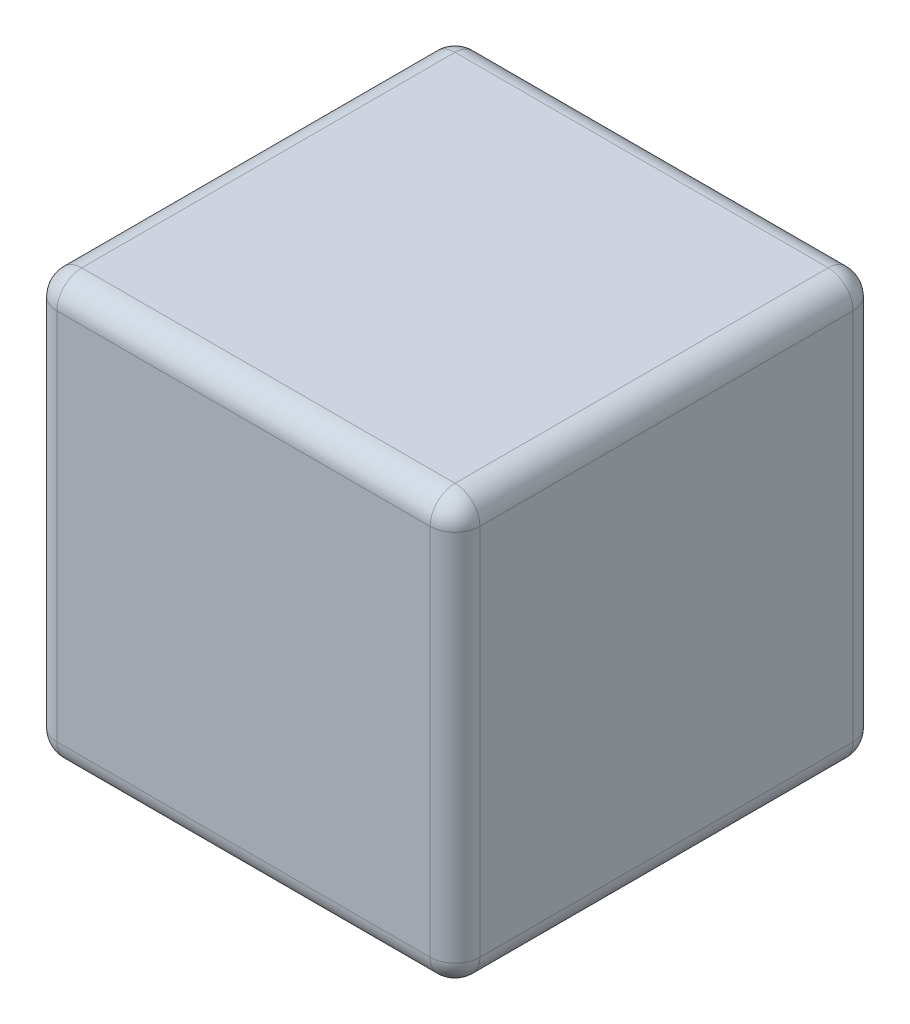
ISO-10303-21;
HEADER;
FILE_DESCRIPTION(('STEP AP214'),'2;1');
FILE_NAME('part.step','',(''),(''),'','','');
FILE_SCHEMA(('AUTOMOTIVE_DESIGN { 1 0 10303 214 1 1 1 1 }'));
ENDSEC;
DATA;
#1=APPLICATION_CONTEXT('core data for automotive mechanical design processes');
#2=APPLICATION_PROTOCOL_DEFINITION('international standard','automotive_design',2000,#1);
#3=PRODUCT_CONTEXT('',#1,'mechanical');
#4=PRODUCT('Part','Part','',(#3));
#5=PRODUCT_RELATED_PRODUCT_CATEGORY('part','',(#4));
#6=PRODUCT_DEFINITION_FORMATION('','',#4);
#7=PRODUCT_DEFINITION_CONTEXT('part definition',#1,'design');
#8=PRODUCT_DEFINITION('design','',#6,#7);
#9=PRODUCT_DEFINITION_SHAPE('','',#8);
#10=(LENGTH_UNIT() NAMED_UNIT(*) SI_UNIT(.MILLI.,.METRE.));
#11=(NAMED_UNIT(*) PLANE_ANGLE_UNIT() SI_UNIT($,.RADIAN.));
#12=(NAMED_UNIT(*) SI_UNIT($,.STERADIAN.) SOLID_ANGLE_UNIT());
#13=UNCERTAINTY_MEASURE_WITH_UNIT(LENGTH_MEASURE(1.E-05),#10,'distance_accuracy_value','');
#14=(GEOMETRIC_REPRESENTATION_CONTEXT(3) GLOBAL_UNCERTAINTY_ASSIGNED_CONTEXT((#13)) GLOBAL_UNIT_ASSIGNED_CONTEXT((#10,
#11,#12)) REPRESENTATION_CONTEXT('',''));
#15=CARTESIAN_POINT('',(0.,0.,0.));
#16=DIRECTION('',(0.,0.,1.));
#17=DIRECTION('',(1.,0.,0.));
#18=AXIS2_PLACEMENT_3D('',#15,#16,#17);
#19=CARTESIAN_POINT('',(0.,17.,0.));
#20=DIRECTION('',(1.,0.,0.));
#21=DIRECTION('',(0.,0.,-1.));
#22=AXIS2_PLACEMENT_3D('',#19,#20,#21);
#23=PLANE('',#22);
#24=DIRECTION('',(0.,0.,1.));
#25=VECTOR('',#24,1.);
#26=CARTESIAN_POINT('',(0.,16.,0.));
#27=LINE('',#26,#25);
#28=CARTESIAN_POINT('',(0.,16.,-1.));
#29=VERTEX_POINT('',#28);
#30=CARTESIAN_POINT('',(0.,16.,-16.));
#31=VERTEX_POINT('',#30);
#32=EDGE_CURVE('E196',#29,#31,#27,.F.);
#33=ORIENTED_EDGE('',*,*,#32,.T.);
#34=DIRECTION('',(0.,-1.,0.));
#35=VECTOR('',#34,1.);
#36=CARTESIAN_POINT('',(0.,17.,-16.));
#37=LINE('',#36,#35);
#38=CARTESIAN_POINT('',(0.,1.,-16.));
#39=VERTEX_POINT('',#38);
#40=EDGE_CURVE('E198',#31,#39,#37,.T.);
#41=ORIENTED_EDGE('',*,*,#40,.T.);
#42=DIRECTION('',(0.,0.,1.));
#43=VECTOR('',#42,1.);
#44=CARTESIAN_POINT('',(0.,1.,0.));
#45=LINE('',#44,#43);
#46=CARTESIAN_POINT('',(0.,1.,-1.));
#47=VERTEX_POINT('',#46);
#48=EDGE_CURVE('E194',#39,#47,#45,.T.);
#49=ORIENTED_EDGE('',*,*,#48,.T.);
#50=DIRECTION('',(0.,-1.,0.));
#51=VECTOR('',#50,1.);
#52=CARTESIAN_POINT('',(0.,17.,-1.));
#53=LINE('',#52,#51);
#54=EDGE_CURVE('E192',#47,#29,#53,.F.);
#55=ORIENTED_EDGE('',*,*,#54,.T.);
#56=EDGE_LOOP('',(#33,#41,#49,#55));
#57=FACE_BOUND('',#56,.T.);
#58=ADVANCED_FACE('F40',(#57),#23,.F.);
#59=CARTESIAN_POINT('',(0.,17.,0.));
#60=DIRECTION('',(0.,0.,-1.));
#61=DIRECTION('',(-1.,0.,0.));
#62=AXIS2_PLACEMENT_3D('',#59,#60,#61);
#63=PLANE('',#62);
#64=DIRECTION('',(1.,0.,0.));
#65=VECTOR('',#64,1.);
#66=CARTESIAN_POINT('',(0.,16.,0.));
#67=LINE('',#66,#65);
#68=CARTESIAN_POINT('',(16.,16.,0.));
#69=VERTEX_POINT('',#68);
#70=CARTESIAN_POINT('',(1.,16.,0.));
#71=VERTEX_POINT('',#70);
#72=EDGE_CURVE('E49',#69,#71,#67,.F.);
#73=ORIENTED_EDGE('',*,*,#72,.T.);
#74=DIRECTION('',(0.,-1.,0.));
#75=VECTOR('',#74,1.);
#76=CARTESIAN_POINT('',(1.,17.,0.));
#77=LINE('',#76,#75);
#78=CARTESIAN_POINT('',(1.,1.,0.));
#79=VERTEX_POINT('',#78);
#80=EDGE_CURVE('E11',#71,#79,#77,.T.);
#81=ORIENTED_EDGE('',*,*,#80,.T.);
#82=DIRECTION('',(1.,0.,0.));
#83=VECTOR('',#82,1.);
#84=CARTESIAN_POINT('',(17.,1.,0.));
#85=LINE('',#84,#83);
#86=CARTESIAN_POINT('',(16.,1.,0.));
#87=VERTEX_POINT('',#86);
#88=EDGE_CURVE('E201',#79,#87,#85,.T.);
#89=ORIENTED_EDGE('',*,*,#88,.T.);
#90=DIRECTION('',(0.,-1.,0.));
#91=VECTOR('',#90,1.);
#92=CARTESIAN_POINT('',(16.,17.,0.));
#93=LINE('',#92,#91);
#94=EDGE_CURVE('E60',#87,#69,#93,.F.);
#95=ORIENTED_EDGE('',*,*,#94,.T.);
#96=EDGE_LOOP('',(#73,#81,#89,#95));
#97=FACE_BOUND('',#96,.T.);
#98=ADVANCED_FACE('F303',(#97),#63,.F.);
#99=CARTESIAN_POINT('',(17.,17.,0.));
#100=DIRECTION('',(-1.,0.,0.));
#101=DIRECTION('',(0.,0.,1.));
#102=AXIS2_PLACEMENT_3D('',#99,#100,#101);
#103=PLANE('',#102);
#104=DIRECTION('',(0.,0.,-1.));
#105=VECTOR('',#104,1.);
#106=CARTESIAN_POINT('',(17.,1.,-17.));
#107=LINE('',#106,#105);
#108=CARTESIAN_POINT('',(17.,1.,-1.));
#109=VERTEX_POINT('',#108);
#110=CARTESIAN_POINT('',(17.,1.,-16.));
#111=VERTEX_POINT('',#110);
#112=EDGE_CURVE('E178',#109,#111,#107,.T.);
#113=ORIENTED_EDGE('',*,*,#112,.T.);
#114=DIRECTION('',(0.,-1.,0.));
#115=VECTOR('',#114,1.);
#116=CARTESIAN_POINT('',(17.,17.,-16.));
#117=LINE('',#116,#115);
#118=CARTESIAN_POINT('',(17.,16.,-16.));
#119=VERTEX_POINT('',#118);
#120=EDGE_CURVE('E180',#111,#119,#117,.F.);
#121=ORIENTED_EDGE('',*,*,#120,.T.);
#122=DIRECTION('',(0.,0.,-1.));
#123=VECTOR('',#122,1.);
#124=CARTESIAN_POINT('',(17.,16.,0.));
#125=LINE('',#124,#123);
#126=CARTESIAN_POINT('',(17.,16.,-1.));
#127=VERTEX_POINT('',#126);
#128=EDGE_CURVE('E176',#119,#127,#125,.F.);
#129=ORIENTED_EDGE('',*,*,#128,.T.);
#130=DIRECTION('',(0.,-1.,0.));
#131=VECTOR('',#130,1.);
#132=CARTESIAN_POINT('',(17.,17.,-1.));
#133=LINE('',#132,#131);
#134=EDGE_CURVE('E174',#127,#109,#133,.T.);
#135=ORIENTED_EDGE('',*,*,#134,.T.);
#136=EDGE_LOOP('',(#113,#121,#129,#135));
#137=FACE_BOUND('',#136,.T.);
#138=ADVANCED_FACE('F275',(#137),#103,.F.);
#139=CARTESIAN_POINT('',(0.,17.,-17.));
#140=DIRECTION('',(0.,0.,1.));
#141=DIRECTION('',(1.,0.,0.));
#142=AXIS2_PLACEMENT_3D('',#139,#140,#141);
#143=PLANE('',#142);
#144=DIRECTION('',(0.,-1.,0.));
#145=VECTOR('',#144,1.);
#146=CARTESIAN_POINT('',(16.,17.,-17.));
#147=LINE('',#146,#145);
#148=CARTESIAN_POINT('',(16.,16.,-17.));
#149=VERTEX_POINT('',#148);
#150=CARTESIAN_POINT('',(16.,1.,-17.));
#151=VERTEX_POINT('',#150);
#152=EDGE_CURVE('E161',#149,#151,#147,.T.);
#153=ORIENTED_EDGE('',*,*,#152,.T.);
#154=DIRECTION('',(-1.,0.,0.));
#155=VECTOR('',#154,1.);
#156=CARTESIAN_POINT('',(0.,1.,-17.));
#157=LINE('',#156,#155);
#158=CARTESIAN_POINT('',(1.,1.,-17.));
#159=VERTEX_POINT('',#158);
#160=EDGE_CURVE('E133',#151,#159,#157,.T.);
#161=ORIENTED_EDGE('',*,*,#160,.T.);
#162=DIRECTION('',(0.,-1.,0.));
#163=VECTOR('',#162,1.);
#164=CARTESIAN_POINT('',(1.,17.,-17.));
#165=LINE('',#164,#163);
#166=CARTESIAN_POINT('',(1.,16.,-17.));
#167=VERTEX_POINT('',#166);
#168=EDGE_CURVE('E151',#159,#167,#165,.F.);
#169=ORIENTED_EDGE('',*,*,#168,.T.);
#170=DIRECTION('',(-1.,0.,0.));
#171=VECTOR('',#170,1.);
#172=CARTESIAN_POINT('',(0.,16.,-17.));
#173=LINE('',#172,#171);
#174=EDGE_CURVE('E157',#167,#149,#173,.F.);
#175=ORIENTED_EDGE('',*,*,#174,.T.);
#176=EDGE_LOOP('',(#153,#161,#169,#175));
#177=FACE_BOUND('',#176,.T.);
#178=ADVANCED_FACE('F159',(#177),#143,.F.);
#179=CARTESIAN_POINT('',(0.,17.,0.));
#180=DIRECTION('',(0.,-1.,0.));
#181=DIRECTION('',(0.,0.,-1.));
#182=AXIS2_PLACEMENT_3D('',#179,#180,#181);
#183=PLANE('',#182);
#184=DIRECTION('',(0.,0.,-1.));
#185=VECTOR('',#184,1.);
#186=CARTESIAN_POINT('',(16.,17.,0.));
#187=LINE('',#186,#185);
#188=CARTESIAN_POINT('',(16.,17.,-1.));
#189=VERTEX_POINT('',#188);
#190=CARTESIAN_POINT('',(16.,17.,-16.));
#191=VERTEX_POINT('',#190);
#192=EDGE_CURVE('E187',#189,#191,#187,.T.);
#193=ORIENTED_EDGE('',*,*,#192,.T.);
#194=DIRECTION('',(-1.,0.,0.));
#195=VECTOR('',#194,1.);
#196=CARTESIAN_POINT('',(0.,17.,-16.));
#197=LINE('',#196,#195);
#198=CARTESIAN_POINT('',(1.,17.,-16.));
#199=VERTEX_POINT('',#198);
#200=EDGE_CURVE('E189',#191,#199,#197,.T.);
#201=ORIENTED_EDGE('',*,*,#200,.T.);
#202=DIRECTION('',(0.,0.,1.));
#203=VECTOR('',#202,1.);
#204=CARTESIAN_POINT('',(1.,17.,0.));
#205=LINE('',#204,#203);
#206=CARTESIAN_POINT('',(1.,17.,-1.));
#207=VERTEX_POINT('',#206);
#208=EDGE_CURVE('E185',#199,#207,#205,.T.);
#209=ORIENTED_EDGE('',*,*,#208,.T.);
#210=DIRECTION('',(1.,0.,0.));
#211=VECTOR('',#210,1.);
#212=CARTESIAN_POINT('',(0.,17.,-1.));
#213=LINE('',#212,#211);
#214=EDGE_CURVE('E183',#207,#189,#213,.T.);
#215=ORIENTED_EDGE('',*,*,#214,.T.);
#216=EDGE_LOOP('',(#193,#201,#209,#215));
#217=FACE_BOUND('',#216,.T.);
#218=ADVANCED_FACE('F284',(#217),#183,.F.);
#219=CARTESIAN_POINT('',(0.,0.,0.));
#220=DIRECTION('',(0.,-1.,0.));
#221=DIRECTION('',(0.,0.,-1.));
#222=AXIS2_PLACEMENT_3D('',#219,#220,#221);
#223=PLANE('',#222);
#224=DIRECTION('',(0.,0.,1.));
#225=VECTOR('',#224,1.);
#226=CARTESIAN_POINT('',(1.,0.,-17.));
#227=LINE('',#226,#225);
#228=CARTESIAN_POINT('',(1.,0.,-1.));
#229=VERTEX_POINT('',#228);
#230=CARTESIAN_POINT('',(1.,0.,-16.));
#231=VERTEX_POINT('',#230);
#232=EDGE_CURVE('E165',#229,#231,#227,.F.);
#233=ORIENTED_EDGE('',*,*,#232,.T.);
#234=DIRECTION('',(-1.,0.,0.));
#235=VECTOR('',#234,1.);
#236=CARTESIAN_POINT('',(17.,0.,-16.));
#237=LINE('',#236,#235);
#238=CARTESIAN_POINT('',(16.,0.,-16.));
#239=VERTEX_POINT('',#238);
#240=EDGE_CURVE('E135',#231,#239,#237,.F.);
#241=ORIENTED_EDGE('',*,*,#240,.T.);
#242=DIRECTION('',(0.,0.,-1.));
#243=VECTOR('',#242,1.);
#244=CARTESIAN_POINT('',(16.,0.,0.));
#245=LINE('',#244,#243);
#246=CARTESIAN_POINT('',(16.,0.,-1.));
#247=VERTEX_POINT('',#246);
#248=EDGE_CURVE('E171',#239,#247,#245,.F.);
#249=ORIENTED_EDGE('',*,*,#248,.T.);
#250=DIRECTION('',(1.,0.,0.));
#251=VECTOR('',#250,1.);
#252=CARTESIAN_POINT('',(0.,0.,-1.));
#253=LINE('',#252,#251);
#254=EDGE_CURVE('E163',#247,#229,#253,.F.);
#255=ORIENTED_EDGE('',*,*,#254,.T.);
#256=EDGE_LOOP('',(#233,#241,#249,#255));
#257=FACE_BOUND('',#256,.T.);
#258=ADVANCED_FACE('F363',(#257),#223,.T.);
#259=CARTESIAN_POINT('',(0.,16.,-1.));
#260=DIRECTION('',(1.,0.,0.));
#261=DIRECTION('',(0.,0.,-1.));
#262=AXIS2_PLACEMENT_3D('',#259,#260,#261);
#263=CYLINDRICAL_SURFACE('',#262,1.);
#264=CARTESIAN_POINT('',(16.,16.,-1.));
#265=DIRECTION('',(1.,0.,0.));
#266=DIRECTION('',(0.,0.,-1.));
#267=AXIS2_PLACEMENT_3D('',#264,#265,#266);
#268=CIRCLE('',#267,1.);
#269=EDGE_CURVE('E44',#189,#69,#268,.T.);
#270=ORIENTED_EDGE('',*,*,#269,.F.);
#271=ORIENTED_EDGE('',*,*,#214,.F.);
#272=CARTESIAN_POINT('',(1.,16.,-1.));
#273=DIRECTION('',(-1.,0.,0.));
#274=DIRECTION('',(0.,0.,1.));
#275=AXIS2_PLACEMENT_3D('',#272,#273,#274);
#276=CIRCLE('',#275,1.);
#277=EDGE_CURVE('E254',#71,#207,#276,.T.);
#278=ORIENTED_EDGE('',*,*,#277,.F.);
#279=ORIENTED_EDGE('',*,*,#72,.F.);
#280=EDGE_LOOP('',(#270,#271,#278,#279));
#281=FACE_BOUND('',#280,.T.);
#282=ADVANCED_FACE('F42',(#281),#263,.T.);
#283=CARTESIAN_POINT('',(16.,16.,-1.));
#284=DIRECTION('',(0.,0.,1.));
#285=DIRECTION('',(1.,0.,0.));
#286=AXIS2_PLACEMENT_3D('',#283,#284,#285);
#287=SPHERICAL_SURFACE('',#286,1.);
#288=CARTESIAN_POINT('',(16.,16.,-1.));
#289=DIRECTION('',(0.,0.,1.));
#290=DIRECTION('',(1.,0.,0.));
#291=AXIS2_PLACEMENT_3D('',#288,#289,#290);
#292=CIRCLE('',#291,1.);
#293=EDGE_CURVE('E249',#189,#127,#292,.F.);
#294=ORIENTED_EDGE('',*,*,#293,.F.);
#295=ORIENTED_EDGE('',*,*,#269,.T.);
#296=CARTESIAN_POINT('',(16.,16.,-1.));
#297=DIRECTION('',(0.,1.,0.));
#298=DIRECTION('',(0.,0.,1.));
#299=AXIS2_PLACEMENT_3D('',#296,#297,#298);
#300=CIRCLE('',#299,1.);
#301=EDGE_CURVE('E252',#127,#69,#300,.F.);
#302=ORIENTED_EDGE('',*,*,#301,.F.);
#303=EDGE_LOOP('',(#294,#295,#302));
#304=FACE_BOUND('',#303,.T.);
#305=ADVANCED_FACE('F264',(#304),#287,.T.);
#306=CARTESIAN_POINT('',(1.,16.,-1.));
#307=DIRECTION('',(0.,1.,0.));
#308=DIRECTION('',(0.,0.,1.));
#309=AXIS2_PLACEMENT_3D('',#306,#307,#308);
#310=SPHERICAL_SURFACE('',#309,1.);
#311=CARTESIAN_POINT('',(1.,16.,-1.));
#312=DIRECTION('',(0.,1.,0.));
#313=DIRECTION('',(0.,0.,1.));
#314=AXIS2_PLACEMENT_3D('',#311,#312,#313);
#315=CIRCLE('',#314,1.);
#316=EDGE_CURVE('E243',#71,#29,#315,.F.);
#317=ORIENTED_EDGE('',*,*,#316,.F.);
#318=ORIENTED_EDGE('',*,*,#277,.T.);
#319=CARTESIAN_POINT('',(1.,16.,-1.));
#320=DIRECTION('',(0.,0.,1.));
#321=DIRECTION('',(1.,0.,0.));
#322=AXIS2_PLACEMENT_3D('',#319,#320,#321);
#323=CIRCLE('',#322,1.);
#324=EDGE_CURVE('E246',#29,#207,#323,.F.);
#325=ORIENTED_EDGE('',*,*,#324,.F.);
#326=EDGE_LOOP('',(#317,#318,#325));
#327=FACE_BOUND('',#326,.T.);
#328=ADVANCED_FACE('F297',(#327),#310,.T.);
#329=CARTESIAN_POINT('',(16.,17.,-1.));
#330=DIRECTION('',(0.,-1.,0.));
#331=DIRECTION('',(0.,0.,-1.));
#332=AXIS2_PLACEMENT_3D('',#329,#330,#331);
#333=CYLINDRICAL_SURFACE('',#332,1.);
#334=ORIENTED_EDGE('',*,*,#301,.T.);
#335=ORIENTED_EDGE('',*,*,#94,.F.);
#336=CARTESIAN_POINT('',(16.,1.,-1.));
#337=DIRECTION('',(0.,-1.,0.));
#338=DIRECTION('',(0.,0.,-1.));
#339=AXIS2_PLACEMENT_3D('',#336,#337,#338);
#340=CIRCLE('',#339,1.);
#341=EDGE_CURVE('E237',#109,#87,#340,.T.);
#342=ORIENTED_EDGE('',*,*,#341,.F.);
#343=ORIENTED_EDGE('',*,*,#134,.F.);
#344=EDGE_LOOP('',(#334,#335,#342,#343));
#345=FACE_BOUND('',#344,.T.);
#346=ADVANCED_FACE('F270',(#345),#333,.T.);
#347=CARTESIAN_POINT('',(16.,16.,0.));
#348=DIRECTION('',(0.,0.,-1.));
#349=DIRECTION('',(-1.,0.,0.));
#350=AXIS2_PLACEMENT_3D('',#347,#348,#349);
#351=CYLINDRICAL_SURFACE('',#350,1.);
#352=ORIENTED_EDGE('',*,*,#293,.T.);
#353=ORIENTED_EDGE('',*,*,#128,.F.);
#354=CARTESIAN_POINT('',(16.,16.,-16.));
#355=DIRECTION('',(0.,0.,-1.));
#356=DIRECTION('',(-1.,0.,0.));
#357=AXIS2_PLACEMENT_3D('',#354,#355,#356);
#358=CIRCLE('',#357,1.);
#359=EDGE_CURVE('E234',#191,#119,#358,.T.);
#360=ORIENTED_EDGE('',*,*,#359,.F.);
#361=ORIENTED_EDGE('',*,*,#192,.F.);
#362=EDGE_LOOP('',(#352,#353,#360,#361));
#363=FACE_BOUND('',#362,.T.);
#364=ADVANCED_FACE('F281',(#363),#351,.T.);
#365=CARTESIAN_POINT('',(0.,16.,-16.));
#366=DIRECTION('',(-1.,0.,0.));
#367=DIRECTION('',(0.,0.,1.));
#368=AXIS2_PLACEMENT_3D('',#365,#366,#367);
#369=CYLINDRICAL_SURFACE('',#368,1.);
#370=CARTESIAN_POINT('',(1.,16.,-16.));
#371=DIRECTION('',(-1.,0.,0.));
#372=DIRECTION('',(0.,0.,1.));
#373=AXIS2_PLACEMENT_3D('',#370,#371,#372);
#374=CIRCLE('',#373,1.);
#375=EDGE_CURVE('E228',#199,#167,#374,.T.);
#376=ORIENTED_EDGE('',*,*,#375,.F.);
#377=ORIENTED_EDGE('',*,*,#200,.F.);
#378=CARTESIAN_POINT('',(16.,16.,-16.));
#379=DIRECTION('',(1.,0.,0.));
#380=DIRECTION('',(0.,0.,-1.));
#381=AXIS2_PLACEMENT_3D('',#378,#379,#380);
#382=CIRCLE('',#381,1.);
#383=EDGE_CURVE('E231',#149,#191,#382,.T.);
#384=ORIENTED_EDGE('',*,*,#383,.F.);
#385=ORIENTED_EDGE('',*,*,#174,.F.);
#386=EDGE_LOOP('',(#376,#377,#384,#385));
#387=FACE_BOUND('',#386,.T.);
#388=ADVANCED_FACE('F288',(#387),#369,.T.);
#389=CARTESIAN_POINT('',(1.,16.,0.));
#390=DIRECTION('',(0.,0.,1.));
#391=DIRECTION('',(1.,0.,0.));
#392=AXIS2_PLACEMENT_3D('',#389,#390,#391);
#393=CYLINDRICAL_SURFACE('',#392,1.);
#394=ORIENTED_EDGE('',*,*,#324,.T.);
#395=ORIENTED_EDGE('',*,*,#208,.F.);
#396=CARTESIAN_POINT('',(1.,16.,-16.));
#397=DIRECTION('',(0.,0.,-1.));
#398=DIRECTION('',(-1.,0.,0.));
#399=AXIS2_PLACEMENT_3D('',#396,#397,#398);
#400=CIRCLE('',#399,1.);
#401=EDGE_CURVE('E226',#31,#199,#400,.T.);
#402=ORIENTED_EDGE('',*,*,#401,.F.);
#403=ORIENTED_EDGE('',*,*,#32,.F.);
#404=EDGE_LOOP('',(#394,#395,#402,#403));
#405=FACE_BOUND('',#404,.T.);
#406=ADVANCED_FACE('F294',(#405),#393,.T.);
#407=CARTESIAN_POINT('',(1.,17.,-1.));
#408=DIRECTION('',(0.,-1.,0.));
#409=DIRECTION('',(0.,0.,-1.));
#410=AXIS2_PLACEMENT_3D('',#407,#408,#409);
#411=CYLINDRICAL_SURFACE('',#410,1.);
#412=ORIENTED_EDGE('',*,*,#316,.T.);
#413=ORIENTED_EDGE('',*,*,#54,.F.);
#414=CARTESIAN_POINT('',(1.,1.,-1.));
#415=DIRECTION('',(0.,-1.,0.));
#416=DIRECTION('',(0.,0.,-1.));
#417=AXIS2_PLACEMENT_3D('',#414,#415,#416);
#418=CIRCLE('',#417,1.);
#419=EDGE_CURVE('E223',#79,#47,#418,.T.);
#420=ORIENTED_EDGE('',*,*,#419,.F.);
#421=ORIENTED_EDGE('',*,*,#80,.F.);
#422=EDGE_LOOP('',(#412,#413,#420,#421));
#423=FACE_BOUND('',#422,.T.);
#424=ADVANCED_FACE('F301',(#423),#411,.T.);
#425=CARTESIAN_POINT('',(0.,1.,-1.));
#426=DIRECTION('',(-1.,0.,0.));
#427=DIRECTION('',(0.,0.,1.));
#428=AXIS2_PLACEMENT_3D('',#425,#426,#427);
#429=CYLINDRICAL_SURFACE('',#428,1.);
#430=CARTESIAN_POINT('',(16.,1.,-1.));
#431=DIRECTION('',(1.,0.,0.));
#432=DIRECTION('',(0.,0.,-1.));
#433=AXIS2_PLACEMENT_3D('',#430,#431,#432);
#434=CIRCLE('',#433,1.);
#435=EDGE_CURVE('E240',#87,#247,#434,.T.);
#436=ORIENTED_EDGE('',*,*,#435,.F.);
#437=ORIENTED_EDGE('',*,*,#88,.F.);
#438=CARTESIAN_POINT('',(1.,1.,-1.));
#439=DIRECTION('',(-1.,0.,0.));
#440=DIRECTION('',(0.,0.,1.));
#441=AXIS2_PLACEMENT_3D('',#438,#439,#440);
#442=CIRCLE('',#441,1.);
#443=EDGE_CURVE('E221',#229,#79,#442,.T.);
#444=ORIENTED_EDGE('',*,*,#443,.F.);
#445=ORIENTED_EDGE('',*,*,#254,.F.);
#446=EDGE_LOOP('',(#436,#437,#444,#445));
#447=FACE_BOUND('',#446,.T.);
#448=ADVANCED_FACE('F306',(#447),#429,.T.);
#449=CARTESIAN_POINT('',(16.,1.,-1.));
#450=DIRECTION('',(0.,0.,1.));
#451=DIRECTION('',(0.,-1.,0.));
#452=AXIS2_PLACEMENT_3D('',#449,#450,#451);
#453=SPHERICAL_SURFACE('',#452,1.);
#454=ORIENTED_EDGE('',*,*,#341,.T.);
#455=ORIENTED_EDGE('',*,*,#435,.T.);
#456=CARTESIAN_POINT('',(16.,1.,-1.));
#457=DIRECTION('',(0.,0.,1.));
#458=DIRECTION('',(1.,0.,0.));
#459=AXIS2_PLACEMENT_3D('',#456,#457,#458);
#460=CIRCLE('',#459,1.);
#461=EDGE_CURVE('E218',#109,#247,#460,.F.);
#462=ORIENTED_EDGE('',*,*,#461,.F.);
#463=EDGE_LOOP('',(#454,#455,#462));
#464=FACE_BOUND('',#463,.T.);
#465=ADVANCED_FACE('F310',(#464),#453,.T.);
#466=CARTESIAN_POINT('',(16.,16.,-16.));
#467=DIRECTION('',(0.,1.,0.));
#468=DIRECTION('',(0.,0.,1.));
#469=AXIS2_PLACEMENT_3D('',#466,#467,#468);
#470=SPHERICAL_SURFACE('',#469,1.);
#471=ORIENTED_EDGE('',*,*,#383,.T.);
#472=ORIENTED_EDGE('',*,*,#359,.T.);
#473=CARTESIAN_POINT('',(16.,16.,-16.));
#474=DIRECTION('',(0.,1.,0.));
#475=DIRECTION('',(0.,0.,1.));
#476=AXIS2_PLACEMENT_3D('',#473,#474,#475);
#477=CIRCLE('',#476,1.);
#478=EDGE_CURVE('E216',#149,#119,#477,.F.);
#479=ORIENTED_EDGE('',*,*,#478,.F.);
#480=EDGE_LOOP('',(#471,#472,#479));
#481=FACE_BOUND('',#480,.T.);
#482=ADVANCED_FACE('F321',(#481),#470,.T.);
#483=CARTESIAN_POINT('',(1.,16.,-16.));
#484=DIRECTION('',(0.,1.,0.));
#485=DIRECTION('',(0.,0.,1.));
#486=AXIS2_PLACEMENT_3D('',#483,#484,#485);
#487=SPHERICAL_SURFACE('',#486,1.);
#488=ORIENTED_EDGE('',*,*,#401,.T.);
#489=ORIENTED_EDGE('',*,*,#375,.T.);
#490=CARTESIAN_POINT('',(1.,16.,-16.));
#491=DIRECTION('',(0.,1.,0.));
#492=DIRECTION('',(0.,0.,1.));
#493=AXIS2_PLACEMENT_3D('',#490,#491,#492);
#494=CIRCLE('',#493,1.);
#495=EDGE_CURVE('E154',#31,#167,#494,.F.);
#496=ORIENTED_EDGE('',*,*,#495,.F.);
#497=EDGE_LOOP('',(#488,#489,#496));
#498=FACE_BOUND('',#497,.T.);
#499=ADVANCED_FACE('F323',(#498),#487,.T.);
#500=CARTESIAN_POINT('',(1.,1.,-1.));
#501=DIRECTION('',(0.,0.,1.));
#502=DIRECTION('',(0.,-1.,0.));
#503=AXIS2_PLACEMENT_3D('',#500,#501,#502);
#504=SPHERICAL_SURFACE('',#503,1.);
#505=ORIENTED_EDGE('',*,*,#443,.T.);
#506=ORIENTED_EDGE('',*,*,#419,.T.);
#507=CARTESIAN_POINT('',(1.,1.,-1.));
#508=DIRECTION('',(0.,0.,1.));
#509=DIRECTION('',(1.,0.,0.));
#510=AXIS2_PLACEMENT_3D('',#507,#508,#509);
#511=CIRCLE('',#510,1.);
#512=EDGE_CURVE('E212',#229,#47,#511,.F.);
#513=ORIENTED_EDGE('',*,*,#512,.F.);
#514=EDGE_LOOP('',(#505,#506,#513));
#515=FACE_BOUND('',#514,.T.);
#516=ADVANCED_FACE('F329',(#515),#504,.T.);
#517=CARTESIAN_POINT('',(16.,1.,0.));
#518=DIRECTION('',(0.,0.,1.));
#519=DIRECTION('',(1.,0.,0.));
#520=AXIS2_PLACEMENT_3D('',#517,#518,#519);
#521=CYLINDRICAL_SURFACE('',#520,1.);
#522=ORIENTED_EDGE('',*,*,#461,.T.);
#523=ORIENTED_EDGE('',*,*,#248,.F.);
#524=CARTESIAN_POINT('',(16.,1.,-16.));
#525=DIRECTION('',(0.,0.,-1.));
#526=DIRECTION('',(-1.,0.,0.));
#527=AXIS2_PLACEMENT_3D('',#524,#525,#526);
#528=CIRCLE('',#527,1.);
#529=EDGE_CURVE('E209',#111,#239,#528,.T.);
#530=ORIENTED_EDGE('',*,*,#529,.F.);
#531=ORIENTED_EDGE('',*,*,#112,.F.);
#532=EDGE_LOOP('',(#522,#523,#530,#531));
#533=FACE_BOUND('',#532,.T.);
#534=ADVANCED_FACE('F314',(#533),#521,.T.);
#535=CARTESIAN_POINT('',(16.,17.,-16.));
#536=DIRECTION('',(0.,-1.,0.));
#537=DIRECTION('',(0.,0.,-1.));
#538=AXIS2_PLACEMENT_3D('',#535,#536,#537);
#539=CYLINDRICAL_SURFACE('',#538,1.);
#540=ORIENTED_EDGE('',*,*,#478,.T.);
#541=ORIENTED_EDGE('',*,*,#120,.F.);
#542=CARTESIAN_POINT('',(16.,1.,-16.));
#543=DIRECTION('',(0.,-1.,0.));
#544=DIRECTION('',(0.,0.,-1.));
#545=AXIS2_PLACEMENT_3D('',#542,#543,#544);
#546=CIRCLE('',#545,1.);
#547=EDGE_CURVE('E148',#151,#111,#546,.T.);
#548=ORIENTED_EDGE('',*,*,#547,.F.);
#549=ORIENTED_EDGE('',*,*,#152,.F.);
#550=EDGE_LOOP('',(#540,#541,#548,#549));
#551=FACE_BOUND('',#550,.T.);
#552=ADVANCED_FACE('F319',(#551),#539,.T.);
#553=CARTESIAN_POINT('',(1.,17.,-16.));
#554=DIRECTION('',(0.,-1.,0.));
#555=DIRECTION('',(0.,0.,-1.));
#556=AXIS2_PLACEMENT_3D('',#553,#554,#555);
#557=CYLINDRICAL_SURFACE('',#556,1.);
#558=ORIENTED_EDGE('',*,*,#495,.T.);
#559=ORIENTED_EDGE('',*,*,#168,.F.);
#560=CARTESIAN_POINT('',(1.,1.,-16.));
#561=DIRECTION('',(0.,-1.,0.));
#562=DIRECTION('',(0.,0.,-1.));
#563=AXIS2_PLACEMENT_3D('',#560,#561,#562);
#564=CIRCLE('',#563,1.);
#565=EDGE_CURVE('E140',#39,#159,#564,.T.);
#566=ORIENTED_EDGE('',*,*,#565,.F.);
#567=ORIENTED_EDGE('',*,*,#40,.F.);
#568=EDGE_LOOP('',(#558,#559,#566,#567));
#569=FACE_BOUND('',#568,.T.);
#570=ADVANCED_FACE('F152',(#569),#557,.T.);
#571=CARTESIAN_POINT('',(1.,1.,0.));
#572=DIRECTION('',(0.,0.,-1.));
#573=DIRECTION('',(-1.,0.,0.));
#574=AXIS2_PLACEMENT_3D('',#571,#572,#573);
#575=CYLINDRICAL_SURFACE('',#574,1.);
#576=ORIENTED_EDGE('',*,*,#512,.T.);
#577=ORIENTED_EDGE('',*,*,#48,.F.);
#578=CARTESIAN_POINT('',(1.,1.,-16.));
#579=DIRECTION('',(0.,0.,-1.));
#580=DIRECTION('',(-1.,0.,0.));
#581=AXIS2_PLACEMENT_3D('',#578,#579,#580);
#582=CIRCLE('',#581,1.);
#583=EDGE_CURVE('E144',#231,#39,#582,.T.);
#584=ORIENTED_EDGE('',*,*,#583,.F.);
#585=ORIENTED_EDGE('',*,*,#232,.F.);
#586=EDGE_LOOP('',(#576,#577,#584,#585));
#587=FACE_BOUND('',#586,.T.);
#588=ADVANCED_FACE('F347',(#587),#575,.T.);
#589=CARTESIAN_POINT('',(16.,1.,-16.));
#590=DIRECTION('',(1.,0.,0.));
#591=DIRECTION('',(0.,1.,0.));
#592=AXIS2_PLACEMENT_3D('',#589,#590,#591);
#593=SPHERICAL_SURFACE('',#592,1.);
#594=ORIENTED_EDGE('',*,*,#547,.T.);
#595=ORIENTED_EDGE('',*,*,#529,.T.);
#596=CARTESIAN_POINT('',(16.,1.,-16.));
#597=DIRECTION('',(1.,0.,0.));
#598=DIRECTION('',(0.,0.,-1.));
#599=AXIS2_PLACEMENT_3D('',#596,#597,#598);
#600=CIRCLE('',#599,1.);
#601=EDGE_CURVE('E137',#151,#239,#600,.F.);
#602=ORIENTED_EDGE('',*,*,#601,.F.);
#603=EDGE_LOOP('',(#594,#595,#602));
#604=FACE_BOUND('',#603,.T.);
#605=ADVANCED_FACE('F317',(#604),#593,.T.);
#606=CARTESIAN_POINT('',(1.,1.,-16.));
#607=DIRECTION('',(-1.,0.,0.));
#608=DIRECTION('',(0.,-1.,0.));
#609=AXIS2_PLACEMENT_3D('',#606,#607,#608);
#610=SPHERICAL_SURFACE('',#609,1.);
#611=ORIENTED_EDGE('',*,*,#583,.T.);
#612=ORIENTED_EDGE('',*,*,#565,.T.);
#613=CARTESIAN_POINT('',(1.,1.,-16.));
#614=DIRECTION('',(-1.,0.,0.));
#615=DIRECTION('',(0.,0.,1.));
#616=AXIS2_PLACEMENT_3D('',#613,#614,#615);
#617=CIRCLE('',#616,1.);
#618=EDGE_CURVE('E129',#231,#159,#617,.F.);
#619=ORIENTED_EDGE('',*,*,#618,.F.);
#620=EDGE_LOOP('',(#611,#612,#619));
#621=FACE_BOUND('',#620,.T.);
#622=ADVANCED_FACE('F142',(#621),#610,.T.);
#623=CARTESIAN_POINT('',(0.,1.,-16.));
#624=DIRECTION('',(1.,0.,0.));
#625=DIRECTION('',(0.,0.,-1.));
#626=AXIS2_PLACEMENT_3D('',#623,#624,#625);
#627=CYLINDRICAL_SURFACE('',#626,1.);
#628=ORIENTED_EDGE('',*,*,#601,.T.);
#629=ORIENTED_EDGE('',*,*,#240,.F.);
#630=ORIENTED_EDGE('',*,*,#618,.T.);
#631=ORIENTED_EDGE('',*,*,#160,.F.);
#632=EDGE_LOOP('',(#628,#629,#630,#631));
#633=FACE_BOUND('',#632,.T.);
#634=ADVANCED_FACE('F131',(#633),#627,.T.);
#635=CLOSED_SHELL('',(#58,#98,#138,#178,#218,#258,#282,#305,#328,#346,#364,#388,#406,#424,#448,
#465,#482,#499,#516,#534,#552,#570,#588,#605,#622,#634));
#636=MANIFOLD_SOLID_BREP('B2',#635);
#637=ADVANCED_BREP_SHAPE_REPRESENTATION('',(#18,#636),#14);
#638=SHAPE_DEFINITION_REPRESENTATION(#9,#637);
ENDSEC;
END-ISO-10303-21;
